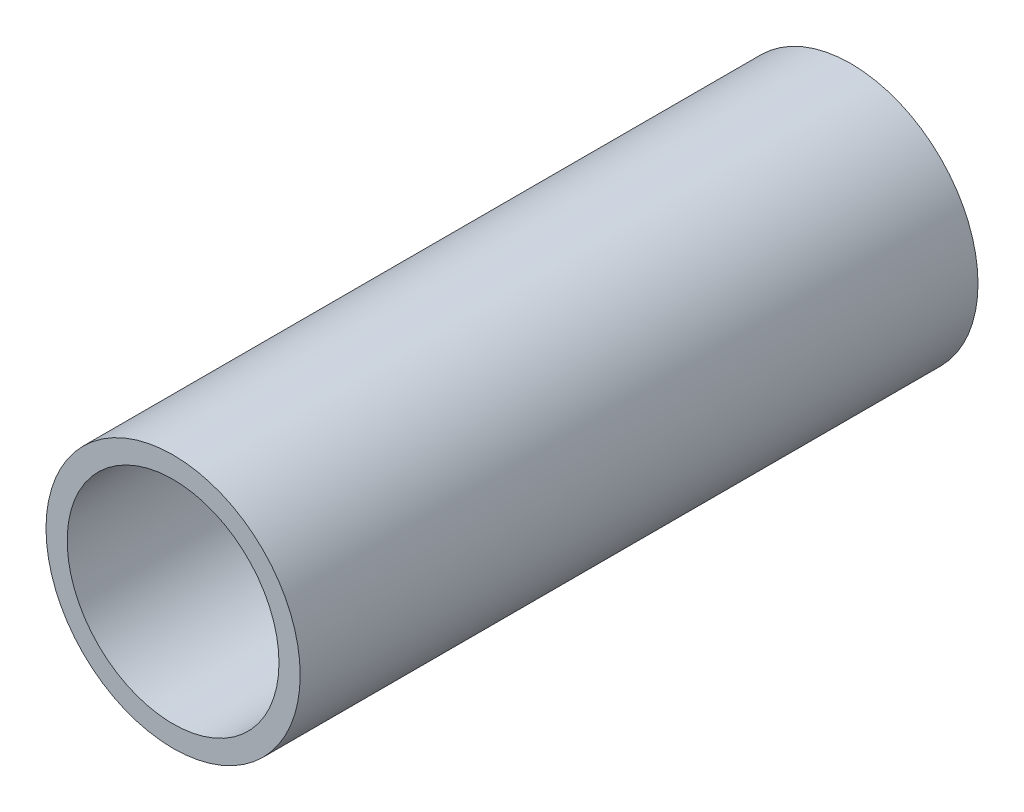
ISO-10303-21;
HEADER;
FILE_DESCRIPTION(('STEP AP214'),'2;1');
FILE_NAME('part.step','',(''),(''),'','','');
FILE_SCHEMA(('AUTOMOTIVE_DESIGN { 1 0 10303 214 1 1 1 1 }'));
ENDSEC;
DATA;
#1=APPLICATION_CONTEXT('core data for automotive mechanical design processes');
#2=APPLICATION_PROTOCOL_DEFINITION('international standard','automotive_design',2000,#1);
#3=PRODUCT_CONTEXT('',#1,'mechanical');
#4=PRODUCT('Part','Part','',(#3));
#5=PRODUCT_RELATED_PRODUCT_CATEGORY('part','',(#4));
#6=PRODUCT_DEFINITION_FORMATION('','',#4);
#7=PRODUCT_DEFINITION_CONTEXT('part definition',#1,'design');
#8=PRODUCT_DEFINITION('design','',#6,#7);
#9=PRODUCT_DEFINITION_SHAPE('','',#8);
#10=(LENGTH_UNIT() NAMED_UNIT(*) SI_UNIT(.MILLI.,.METRE.));
#11=(NAMED_UNIT(*) PLANE_ANGLE_UNIT() SI_UNIT($,.RADIAN.));
#12=(NAMED_UNIT(*) SI_UNIT($,.STERADIAN.) SOLID_ANGLE_UNIT());
#13=UNCERTAINTY_MEASURE_WITH_UNIT(LENGTH_MEASURE(1.E-05),#10,'distance_accuracy_value','');
#14=(GEOMETRIC_REPRESENTATION_CONTEXT(3) GLOBAL_UNCERTAINTY_ASSIGNED_CONTEXT((#13)) GLOBAL_UNIT_ASSIGNED_CONTEXT((#10,
#11,#12)) REPRESENTATION_CONTEXT('',''));
#15=CARTESIAN_POINT('',(0.,0.,0.));
#16=DIRECTION('',(0.,0.,1.));
#17=DIRECTION('',(1.,0.,0.));
#18=AXIS2_PLACEMENT_3D('',#15,#16,#17);
#19=CARTESIAN_POINT('',(0.,0.,160.));
#20=DIRECTION('',(0.,0.,1.));
#21=DIRECTION('',(1.,0.,0.));
#22=AXIS2_PLACEMENT_3D('',#19,#20,#21);
#23=PLANE('',#22);
#24=CARTESIAN_POINT('',(0.,0.,160.));
#25=DIRECTION('',(0.,0.,1.));
#26=DIRECTION('',(1.,0.,0.));
#27=AXIS2_PLACEMENT_3D('',#24,#25,#26);
#28=CIRCLE('',#27,30.);
#29=CARTESIAN_POINT('',(30.,0.,160.));
#30=VERTEX_POINT('',#29);
#31=EDGE_CURVE('E10',#30,#30,#28,.T.);
#32=ORIENTED_EDGE('',*,*,#31,.T.);
#33=EDGE_LOOP('',(#32));
#34=FACE_BOUND('',#33,.T.);
#35=CARTESIAN_POINT('',(0.,0.,160.));
#36=DIRECTION('',(0.,0.,1.));
#37=DIRECTION('',(1.,0.,0.));
#38=AXIS2_PLACEMENT_3D('',#35,#36,#37);
#39=CIRCLE('',#38,25.);
#40=CARTESIAN_POINT('',(25.,0.,160.));
#41=VERTEX_POINT('',#40);
#42=EDGE_CURVE('E57',#41,#41,#39,.T.);
#43=ORIENTED_EDGE('',*,*,#42,.F.);
#44=EDGE_LOOP('',(#43));
#45=FACE_BOUND('',#44,.T.);
#46=ADVANCED_FACE('F43',(#34,#45),#23,.T.);
#47=CARTESIAN_POINT('',(0.,0.,0.));
#48=DIRECTION('',(0.,0.,1.));
#49=DIRECTION('',(1.,0.,0.));
#50=AXIS2_PLACEMENT_3D('',#47,#48,#49);
#51=PLANE('',#50);
#52=CARTESIAN_POINT('',(0.,0.,0.));
#53=DIRECTION('',(0.,0.,1.));
#54=DIRECTION('',(1.,0.,0.));
#55=AXIS2_PLACEMENT_3D('',#52,#53,#54);
#56=CIRCLE('',#55,30.);
#57=CARTESIAN_POINT('',(30.,0.,0.));
#58=VERTEX_POINT('',#57);
#59=EDGE_CURVE('E48',#58,#58,#56,.T.);
#60=ORIENTED_EDGE('',*,*,#59,.F.);
#61=EDGE_LOOP('',(#60));
#62=FACE_BOUND('',#61,.T.);
#63=CARTESIAN_POINT('',(0.,0.,0.));
#64=DIRECTION('',(0.,0.,1.));
#65=DIRECTION('',(1.,0.,0.));
#66=AXIS2_PLACEMENT_3D('',#63,#64,#65);
#67=CIRCLE('',#66,25.);
#68=CARTESIAN_POINT('',(25.,0.,0.));
#69=VERTEX_POINT('',#68);
#70=EDGE_CURVE('E59',#69,#69,#67,.T.);
#71=ORIENTED_EDGE('',*,*,#70,.T.);
#72=EDGE_LOOP('',(#71));
#73=FACE_BOUND('',#72,.T.);
#74=ADVANCED_FACE('F71',(#62,#73),#51,.F.);
#75=CARTESIAN_POINT('',(0.,0.,160.));
#76=DIRECTION('',(0.,0.,-1.));
#77=DIRECTION('',(-1.,0.,0.));
#78=AXIS2_PLACEMENT_3D('',#75,#76,#77);
#79=CYLINDRICAL_SURFACE('',#78,30.);
#80=ORIENTED_EDGE('',*,*,#31,.F.);
#81=EDGE_LOOP('',(#80));
#82=FACE_BOUND('',#81,.T.);
#83=ORIENTED_EDGE('',*,*,#59,.T.);
#84=EDGE_LOOP('',(#83));
#85=FACE_BOUND('',#84,.T.);
#86=ADVANCED_FACE('F46',(#82,#85),#79,.T.);
#87=CARTESIAN_POINT('',(0.,0.,160.));
#88=DIRECTION('',(0.,0.,-1.));
#89=DIRECTION('',(-1.,0.,0.));
#90=AXIS2_PLACEMENT_3D('',#87,#88,#89);
#91=CYLINDRICAL_SURFACE('',#90,25.);
#92=ORIENTED_EDGE('',*,*,#42,.T.);
#93=EDGE_LOOP('',(#92));
#94=FACE_BOUND('',#93,.T.);
#95=ORIENTED_EDGE('',*,*,#70,.F.);
#96=EDGE_LOOP('',(#95));
#97=FACE_BOUND('',#96,.T.);
#98=ADVANCED_FACE('F67',(#94,#97),#91,.F.);
#99=CLOSED_SHELL('',(#46,#74,#86,#98));
#100=MANIFOLD_SOLID_BREP('B2',#99);
#101=ADVANCED_BREP_SHAPE_REPRESENTATION('',(#18,#100),#14);
#102=SHAPE_DEFINITION_REPRESENTATION(#9,#101);
ENDSEC;
END-ISO-10303-21;
